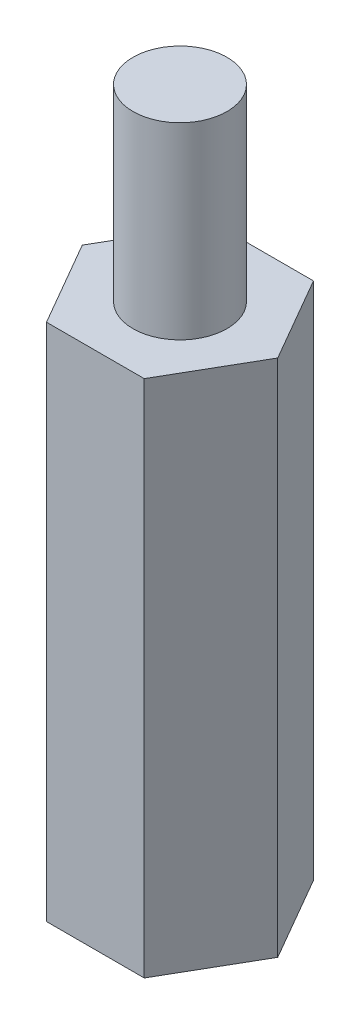
ISO-10303-21;
HEADER;
FILE_DESCRIPTION(('STEP AP214'),'2;1');
FILE_NAME('part.step','',(''),(''),'','','');
FILE_SCHEMA(('AUTOMOTIVE_DESIGN { 1 0 10303 214 1 1 1 1 }'));
ENDSEC;
DATA;
#1=APPLICATION_CONTEXT('core data for automotive mechanical design processes');
#2=APPLICATION_PROTOCOL_DEFINITION('international standard','automotive_design',2000,#1);
#3=PRODUCT_CONTEXT('',#1,'mechanical');
#4=PRODUCT('Part','Part','',(#3));
#5=PRODUCT_RELATED_PRODUCT_CATEGORY('part','',(#4));
#6=PRODUCT_DEFINITION_FORMATION('','',#4);
#7=PRODUCT_DEFINITION_CONTEXT('part definition',#1,'design');
#8=PRODUCT_DEFINITION('design','',#6,#7);
#9=PRODUCT_DEFINITION_SHAPE('','',#8);
#10=(LENGTH_UNIT() NAMED_UNIT(*) SI_UNIT(.MILLI.,.METRE.));
#11=(NAMED_UNIT(*) PLANE_ANGLE_UNIT() SI_UNIT($,.RADIAN.));
#12=(NAMED_UNIT(*) SI_UNIT($,.STERADIAN.) SOLID_ANGLE_UNIT());
#13=UNCERTAINTY_MEASURE_WITH_UNIT(LENGTH_MEASURE(1.E-05),#10,'distance_accuracy_value','');
#14=(GEOMETRIC_REPRESENTATION_CONTEXT(3) GLOBAL_UNCERTAINTY_ASSIGNED_CONTEXT((#13)) GLOBAL_UNIT_ASSIGNED_CONTEXT((#10,
#11,#12)) REPRESENTATION_CONTEXT('',''));
#15=CARTESIAN_POINT('',(0.,0.,0.));
#16=DIRECTION('',(0.,0.,1.));
#17=DIRECTION('',(1.,0.,0.));
#18=AXIS2_PLACEMENT_3D('',#15,#16,#17);
#19=CARTESIAN_POINT('',(1.29903810567666,13.8,2.25));
#20=DIRECTION('',(-0.866025403784439,0.,-0.5));
#21=DIRECTION('',(-0.5,0.,0.866025403784439));
#22=AXIS2_PLACEMENT_3D('',#19,#20,#21);
#23=PLANE('',#22);
#24=DIRECTION('',(0.5,0.,-0.866025403784439));
#25=VECTOR('',#24,1.);
#26=CARTESIAN_POINT('',(1.29903810567666,0.,2.25));
#27=LINE('',#26,#25);
#28=CARTESIAN_POINT('',(1.29903810567666,0.,2.25));
#29=VERTEX_POINT('',#28);
#30=CARTESIAN_POINT('',(2.59807621135332,0.,0.));
#31=VERTEX_POINT('',#30);
#32=EDGE_CURVE('E119',#29,#31,#27,.T.);
#33=ORIENTED_EDGE('',*,*,#32,.T.);
#34=DIRECTION('',(0.,-1.,0.));
#35=VECTOR('',#34,1.);
#36=CARTESIAN_POINT('',(2.59807621135332,13.8,0.));
#37=LINE('',#36,#35);
#38=CARTESIAN_POINT('',(2.59807621135332,13.8,0.));
#39=VERTEX_POINT('',#38);
#40=EDGE_CURVE('E36',#39,#31,#37,.T.);
#41=ORIENTED_EDGE('',*,*,#40,.F.);
#42=DIRECTION('',(0.5,0.,-0.866025403784439));
#43=VECTOR('',#42,1.);
#44=CARTESIAN_POINT('',(1.29903810567666,13.8,2.25));
#45=LINE('',#44,#43);
#46=CARTESIAN_POINT('',(1.29903810567666,13.8,2.25));
#47=VERTEX_POINT('',#46);
#48=EDGE_CURVE('E130',#47,#39,#45,.T.);
#49=ORIENTED_EDGE('',*,*,#48,.F.);
#50=DIRECTION('',(0.,-1.,0.));
#51=VECTOR('',#50,1.);
#52=CARTESIAN_POINT('',(1.29903810567666,13.8,2.25));
#53=LINE('',#52,#51);
#54=EDGE_CURVE('E115',#47,#29,#53,.T.);
#55=ORIENTED_EDGE('',*,*,#54,.T.);
#56=EDGE_LOOP('',(#33,#41,#49,#55));
#57=FACE_BOUND('',#56,.T.);
#58=ADVANCED_FACE('F33',(#57),#23,.F.);
#59=CARTESIAN_POINT('',(2.59807621135332,13.8,0.));
#60=DIRECTION('',(-0.866025403784439,0.,0.5));
#61=DIRECTION('',(0.5,0.,0.866025403784439));
#62=AXIS2_PLACEMENT_3D('',#59,#60,#61);
#63=PLANE('',#62);
#64=DIRECTION('',(-0.5,0.,-0.866025403784439));
#65=VECTOR('',#64,1.);
#66=CARTESIAN_POINT('',(2.59807621135332,0.,0.));
#67=LINE('',#66,#65);
#68=CARTESIAN_POINT('',(1.29903810567666,0.,-2.25));
#69=VERTEX_POINT('',#68);
#70=EDGE_CURVE('E122',#31,#69,#67,.T.);
#71=ORIENTED_EDGE('',*,*,#70,.T.);
#72=DIRECTION('',(0.,-1.,0.));
#73=VECTOR('',#72,1.);
#74=CARTESIAN_POINT('',(1.29903810567666,13.8,-2.25));
#75=LINE('',#74,#73);
#76=CARTESIAN_POINT('',(1.29903810567666,13.8,-2.25));
#77=VERTEX_POINT('',#76);
#78=EDGE_CURVE('E133',#77,#69,#75,.T.);
#79=ORIENTED_EDGE('',*,*,#78,.F.);
#80=DIRECTION('',(-0.5,0.,-0.866025403784439));
#81=VECTOR('',#80,1.);
#82=CARTESIAN_POINT('',(2.59807621135332,13.8,0.));
#83=LINE('',#82,#81);
#84=EDGE_CURVE('E88',#39,#77,#83,.T.);
#85=ORIENTED_EDGE('',*,*,#84,.F.);
#86=ORIENTED_EDGE('',*,*,#40,.T.);
#87=EDGE_LOOP('',(#71,#79,#85,#86));
#88=FACE_BOUND('',#87,.T.);
#89=ADVANCED_FACE('F138',(#88),#63,.F.);
#90=CARTESIAN_POINT('',(1.29903810567666,13.8,-2.25));
#91=DIRECTION('',(0.,0.,1.));
#92=DIRECTION('',(1.,0.,0.));
#93=AXIS2_PLACEMENT_3D('',#90,#91,#92);
#94=PLANE('',#93);
#95=DIRECTION('',(-1.,0.,0.));
#96=VECTOR('',#95,1.);
#97=CARTESIAN_POINT('',(1.29903810567666,0.,-2.25));
#98=LINE('',#97,#96);
#99=CARTESIAN_POINT('',(-1.29903810567666,0.,-2.25));
#100=VERTEX_POINT('',#99);
#101=EDGE_CURVE('E125',#69,#100,#98,.T.);
#102=ORIENTED_EDGE('',*,*,#101,.T.);
#103=DIRECTION('',(0.,-1.,0.));
#104=VECTOR('',#103,1.);
#105=CARTESIAN_POINT('',(-1.29903810567666,13.8,-2.25));
#106=LINE('',#105,#104);
#107=CARTESIAN_POINT('',(-1.29903810567666,13.8,-2.25));
#108=VERTEX_POINT('',#107);
#109=EDGE_CURVE('E110',#108,#100,#106,.T.);
#110=ORIENTED_EDGE('',*,*,#109,.F.);
#111=DIRECTION('',(-1.,0.,0.));
#112=VECTOR('',#111,1.);
#113=CARTESIAN_POINT('',(1.29903810567666,13.8,-2.25));
#114=LINE('',#113,#112);
#115=EDGE_CURVE('E101',#77,#108,#114,.T.);
#116=ORIENTED_EDGE('',*,*,#115,.F.);
#117=ORIENTED_EDGE('',*,*,#78,.T.);
#118=EDGE_LOOP('',(#102,#110,#116,#117));
#119=FACE_BOUND('',#118,.T.);
#120=ADVANCED_FACE('F144',(#119),#94,.F.);
#121=CARTESIAN_POINT('',(-1.29903810567666,13.8,-2.25));
#122=DIRECTION('',(0.866025403784439,0.,0.5));
#123=DIRECTION('',(0.5,0.,-0.866025403784439));
#124=AXIS2_PLACEMENT_3D('',#121,#122,#123);
#125=PLANE('',#124);
#126=DIRECTION('',(-0.5,0.,0.866025403784439));
#127=VECTOR('',#126,1.);
#128=CARTESIAN_POINT('',(-1.29903810567666,0.,-2.25));
#129=LINE('',#128,#127);
#130=CARTESIAN_POINT('',(-2.59807621135332,0.,0.));
#131=VERTEX_POINT('',#130);
#132=EDGE_CURVE('E109',#100,#131,#129,.T.);
#133=ORIENTED_EDGE('',*,*,#132,.T.);
#134=DIRECTION('',(0.,-1.,0.));
#135=VECTOR('',#134,1.);
#136=CARTESIAN_POINT('',(-2.59807621135332,13.8,0.));
#137=LINE('',#136,#135);
#138=CARTESIAN_POINT('',(-2.59807621135332,13.8,0.));
#139=VERTEX_POINT('',#138);
#140=EDGE_CURVE('E106',#139,#131,#137,.T.);
#141=ORIENTED_EDGE('',*,*,#140,.F.);
#142=DIRECTION('',(-0.5,0.,0.866025403784439));
#143=VECTOR('',#142,1.);
#144=CARTESIAN_POINT('',(-1.29903810567666,13.8,-2.25));
#145=LINE('',#144,#143);
#146=EDGE_CURVE('E95',#108,#139,#145,.T.);
#147=ORIENTED_EDGE('',*,*,#146,.F.);
#148=ORIENTED_EDGE('',*,*,#109,.T.);
#149=EDGE_LOOP('',(#133,#141,#147,#148));
#150=FACE_BOUND('',#149,.T.);
#151=ADVANCED_FACE('F107',(#150),#125,.F.);
#152=CARTESIAN_POINT('',(-2.59807621135332,13.8,0.));
#153=DIRECTION('',(0.866025403784439,0.,-0.5));
#154=DIRECTION('',(-0.5,0.,-0.866025403784439));
#155=AXIS2_PLACEMENT_3D('',#152,#153,#154);
#156=PLANE('',#155);
#157=DIRECTION('',(0.5,0.,0.866025403784439));
#158=VECTOR('',#157,1.);
#159=CARTESIAN_POINT('',(-2.59807621135332,0.,0.));
#160=LINE('',#159,#158);
#161=CARTESIAN_POINT('',(-1.29903810567666,0.,2.25));
#162=VERTEX_POINT('',#161);
#163=EDGE_CURVE('E73',#131,#162,#160,.T.);
#164=ORIENTED_EDGE('',*,*,#163,.T.);
#165=DIRECTION('',(0.,-1.,0.));
#166=VECTOR('',#165,1.);
#167=CARTESIAN_POINT('',(-1.29903810567666,13.8,2.25));
#168=LINE('',#167,#166);
#169=CARTESIAN_POINT('',(-1.29903810567666,13.8,2.25));
#170=VERTEX_POINT('',#169);
#171=EDGE_CURVE('E111',#170,#162,#168,.T.);
#172=ORIENTED_EDGE('',*,*,#171,.F.);
#173=DIRECTION('',(0.5,0.,0.866025403784439));
#174=VECTOR('',#173,1.);
#175=CARTESIAN_POINT('',(-2.59807621135332,13.8,0.));
#176=LINE('',#175,#174);
#177=EDGE_CURVE('E99',#139,#170,#176,.T.);
#178=ORIENTED_EDGE('',*,*,#177,.F.);
#179=ORIENTED_EDGE('',*,*,#140,.T.);
#180=EDGE_LOOP('',(#164,#172,#178,#179));
#181=FACE_BOUND('',#180,.T.);
#182=ADVANCED_FACE('F113',(#181),#156,.F.);
#183=CARTESIAN_POINT('',(-1.29903810567666,13.8,2.25));
#184=DIRECTION('',(0.,0.,-1.));
#185=DIRECTION('',(-1.,0.,0.));
#186=AXIS2_PLACEMENT_3D('',#183,#184,#185);
#187=PLANE('',#186);
#188=DIRECTION('',(1.,0.,0.));
#189=VECTOR('',#188,1.);
#190=CARTESIAN_POINT('',(-1.29903810567666,0.,2.25));
#191=LINE('',#190,#189);
#192=EDGE_CURVE('E79',#162,#29,#191,.T.);
#193=ORIENTED_EDGE('',*,*,#192,.T.);
#194=ORIENTED_EDGE('',*,*,#54,.F.);
#195=DIRECTION('',(1.,0.,0.));
#196=VECTOR('',#195,1.);
#197=CARTESIAN_POINT('',(-1.29903810567666,13.8,2.25));
#198=LINE('',#197,#196);
#199=EDGE_CURVE('E50',#170,#47,#198,.T.);
#200=ORIENTED_EDGE('',*,*,#199,.F.);
#201=ORIENTED_EDGE('',*,*,#171,.T.);
#202=EDGE_LOOP('',(#193,#194,#200,#201));
#203=FACE_BOUND('',#202,.T.);
#204=ADVANCED_FACE('F160',(#203),#187,.F.);
#205=CARTESIAN_POINT('',(0.,13.8,0.));
#206=DIRECTION('',(0.,1.,0.));
#207=DIRECTION('',(0.,0.,1.));
#208=AXIS2_PLACEMENT_3D('',#205,#206,#207);
#209=PLANE('',#208);
#210=CARTESIAN_POINT('',(0.,13.8,0.));
#211=DIRECTION('',(0.,1.,0.));
#212=DIRECTION('',(0.,0.,1.));
#213=AXIS2_PLACEMENT_3D('',#210,#211,#212);
#214=CIRCLE('',#213,1.25);
#215=CARTESIAN_POINT('',(0.,13.8,1.25));
#216=VERTEX_POINT('',#215);
#217=EDGE_CURVE('E11',#216,#216,#214,.T.);
#218=ORIENTED_EDGE('',*,*,#217,.F.);
#219=EDGE_LOOP('',(#218));
#220=FACE_BOUND('',#219,.T.);
#221=ORIENTED_EDGE('',*,*,#48,.T.);
#222=ORIENTED_EDGE('',*,*,#84,.T.);
#223=ORIENTED_EDGE('',*,*,#115,.T.);
#224=ORIENTED_EDGE('',*,*,#146,.T.);
#225=ORIENTED_EDGE('',*,*,#177,.T.);
#226=ORIENTED_EDGE('',*,*,#199,.T.);
#227=EDGE_LOOP('',(#221,#222,#223,#224,#225,#226));
#228=FACE_BOUND('',#227,.T.);
#229=ADVANCED_FACE('F97',(#220,#228),#209,.T.);
#230=CARTESIAN_POINT('',(0.,0.,0.));
#231=DIRECTION('',(0.,1.,0.));
#232=DIRECTION('',(0.,0.,1.));
#233=AXIS2_PLACEMENT_3D('',#230,#231,#232);
#234=PLANE('',#233);
#235=ORIENTED_EDGE('',*,*,#32,.F.);
#236=ORIENTED_EDGE('',*,*,#192,.F.);
#237=ORIENTED_EDGE('',*,*,#163,.F.);
#238=ORIENTED_EDGE('',*,*,#132,.F.);
#239=ORIENTED_EDGE('',*,*,#101,.F.);
#240=ORIENTED_EDGE('',*,*,#70,.F.);
#241=EDGE_LOOP('',(#235,#236,#237,#238,#239,#240));
#242=FACE_BOUND('',#241,.T.);
#243=ADVANCED_FACE('F143',(#242),#234,.F.);
#244=CARTESIAN_POINT('',(0.,18.8,0.));
#245=DIRECTION('',(0.,-1.,0.));
#246=DIRECTION('',(0.,0.,-1.));
#247=AXIS2_PLACEMENT_3D('',#244,#245,#246);
#248=CYLINDRICAL_SURFACE('',#247,1.25);
#249=CARTESIAN_POINT('',(0.,18.8,0.));
#250=DIRECTION('',(0.,1.,0.));
#251=DIRECTION('',(0.,0.,1.));
#252=AXIS2_PLACEMENT_3D('',#249,#250,#251);
#253=CIRCLE('',#252,1.25);
#254=CARTESIAN_POINT('',(0.,18.8,1.25));
#255=VERTEX_POINT('',#254);
#256=EDGE_CURVE('E123',#255,#255,#253,.T.);
#257=ORIENTED_EDGE('',*,*,#256,.F.);
#258=EDGE_LOOP('',(#257));
#259=FACE_BOUND('',#258,.T.);
#260=ORIENTED_EDGE('',*,*,#217,.T.);
#261=EDGE_LOOP('',(#260));
#262=FACE_BOUND('',#261,.T.);
#263=ADVANCED_FACE('F153',(#259,#262),#248,.T.);
#264=CARTESIAN_POINT('',(0.,18.8,0.));
#265=DIRECTION('',(0.,1.,0.));
#266=DIRECTION('',(0.,0.,1.));
#267=AXIS2_PLACEMENT_3D('',#264,#265,#266);
#268=PLANE('',#267);
#269=ORIENTED_EDGE('',*,*,#256,.T.);
#270=EDGE_LOOP('',(#269));
#271=FACE_BOUND('',#270,.T.);
#272=ADVANCED_FACE('F151',(#271),#268,.T.);
#273=CLOSED_SHELL('',(#58,#89,#120,#151,#182,#204,#229,#243,#263,#272));
#274=MANIFOLD_SOLID_BREP('B2',#273);
#275=ADVANCED_BREP_SHAPE_REPRESENTATION('',(#18,#274),#14);
#276=SHAPE_DEFINITION_REPRESENTATION(#9,#275);
ENDSEC;
END-ISO-10303-21;
